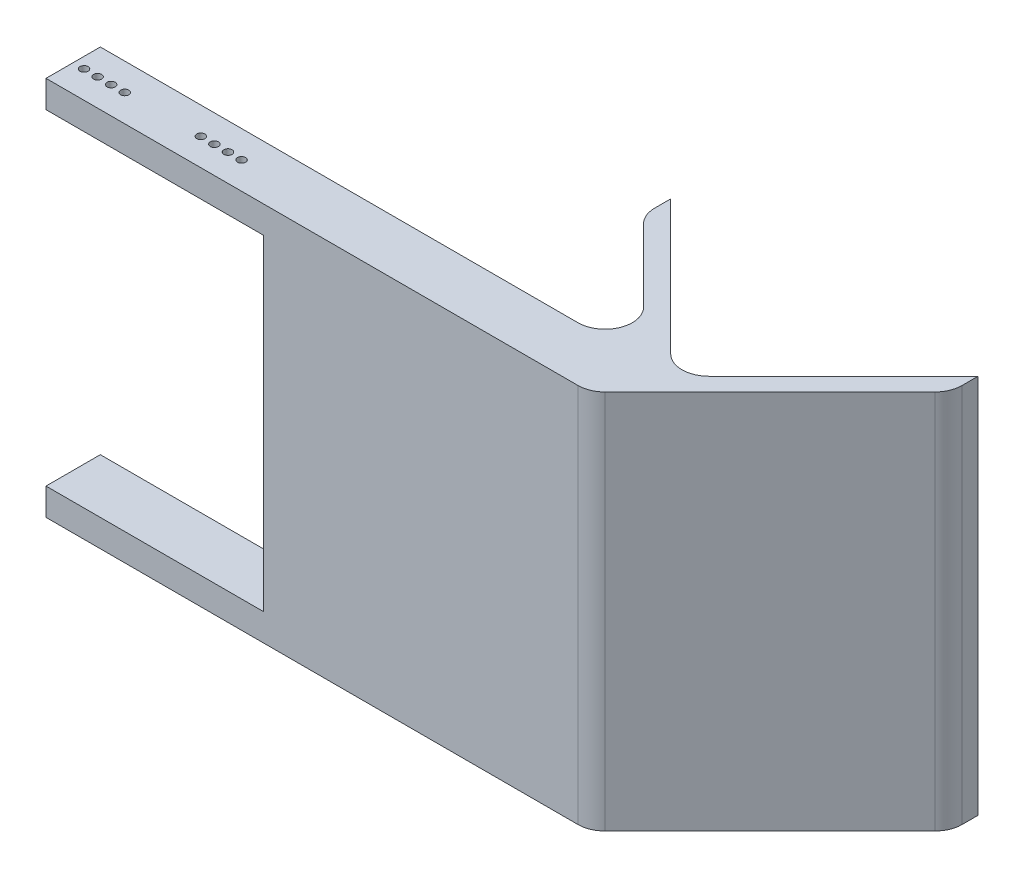
ISO-10303-21;
HEADER;
FILE_DESCRIPTION(('STEP AP214'),'2;1');
FILE_NAME('part.step','',(''),(''),'','','');
FILE_SCHEMA(('AUTOMOTIVE_DESIGN { 1 0 10303 214 1 1 1 1 }'));
ENDSEC;
DATA;
#1=APPLICATION_CONTEXT('core data for automotive mechanical design processes');
#2=APPLICATION_PROTOCOL_DEFINITION('international standard','automotive_design',2000,#1);
#3=PRODUCT_CONTEXT('',#1,'mechanical');
#4=PRODUCT('Part','Part','',(#3));
#5=PRODUCT_RELATED_PRODUCT_CATEGORY('part','',(#4));
#6=PRODUCT_DEFINITION_FORMATION('','',#4);
#7=PRODUCT_DEFINITION_CONTEXT('part definition',#1,'design');
#8=PRODUCT_DEFINITION('design','',#6,#7);
#9=PRODUCT_DEFINITION_SHAPE('','',#8);
#10=(LENGTH_UNIT() NAMED_UNIT(*) SI_UNIT(.MILLI.,.METRE.));
#11=(NAMED_UNIT(*) PLANE_ANGLE_UNIT() SI_UNIT($,.RADIAN.));
#12=(NAMED_UNIT(*) SI_UNIT($,.STERADIAN.) SOLID_ANGLE_UNIT());
#13=UNCERTAINTY_MEASURE_WITH_UNIT(LENGTH_MEASURE(1.E-05),#10,'distance_accuracy_value','');
#14=(GEOMETRIC_REPRESENTATION_CONTEXT(3) GLOBAL_UNCERTAINTY_ASSIGNED_CONTEXT((#13)) GLOBAL_UNIT_ASSIGNED_CONTEXT((#10,
#11,#12)) REPRESENTATION_CONTEXT('',''));
#15=CARTESIAN_POINT('',(0.,0.,0.));
#16=DIRECTION('',(0.,0.,1.));
#17=DIRECTION('',(1.,0.,0.));
#18=AXIS2_PLACEMENT_3D('',#15,#16,#17);
#19=CARTESIAN_POINT('',(-75.,70.,0.));
#20=DIRECTION('',(-1.,0.,0.));
#21=DIRECTION('',(0.,0.,1.));
#22=AXIS2_PLACEMENT_3D('',#19,#20,#21);
#23=PLANE('',#22);
#24=DIRECTION('',(0.,-1.,0.));
#25=VECTOR('',#24,1.);
#26=CARTESIAN_POINT('',(-75.,70.,0.));
#27=LINE('',#26,#25);
#28=CARTESIAN_POINT('',(-75.,5.,0.));
#29=VERTEX_POINT('',#28);
#30=CARTESIAN_POINT('',(-75.,0.,0.));
#31=VERTEX_POINT('',#30);
#32=EDGE_CURVE('E217',#29,#31,#27,.T.);
#33=ORIENTED_EDGE('',*,*,#32,.F.);
#34=DIRECTION('',(0.,0.,-1.));
#35=VECTOR('',#34,1.);
#36=CARTESIAN_POINT('',(-75.,5.,0.));
#37=LINE('',#36,#35);
#38=CARTESIAN_POINT('',(-75.,5.,-10.));
#39=VERTEX_POINT('',#38);
#40=EDGE_CURVE('E186',#29,#39,#37,.T.);
#41=ORIENTED_EDGE('',*,*,#40,.T.);
#42=DIRECTION('',(0.,-1.,0.));
#43=VECTOR('',#42,1.);
#44=CARTESIAN_POINT('',(-75.,70.,-10.));
#45=LINE('',#44,#43);
#46=CARTESIAN_POINT('',(-75.,0.,-10.));
#47=VERTEX_POINT('',#46);
#48=EDGE_CURVE('E250',#39,#47,#45,.T.);
#49=ORIENTED_EDGE('',*,*,#48,.T.);
#50=DIRECTION('',(0.,0.,-1.));
#51=VECTOR('',#50,1.);
#52=CARTESIAN_POINT('',(-75.,0.,0.));
#53=LINE('',#52,#51);
#54=EDGE_CURVE('E220',#31,#47,#53,.T.);
#55=ORIENTED_EDGE('',*,*,#54,.F.);
#56=EDGE_LOOP('',(#33,#41,#49,#55));
#57=FACE_BOUND('',#56,.T.);
#58=ADVANCED_FACE('F33',(#57),#23,.T.);
#59=CARTESIAN_POINT('',(24.9999999999995,70.,0.));
#60=DIRECTION('',(0.,0.,1.));
#61=DIRECTION('',(1.,0.,0.));
#62=AXIS2_PLACEMENT_3D('',#59,#60,#61);
#63=PLANE('',#62);
#64=DIRECTION('',(1.,0.,0.));
#65=VECTOR('',#64,1.);
#66=CARTESIAN_POINT('',(-75.,65.,0.));
#67=LINE('',#66,#65);
#68=CARTESIAN_POINT('',(-75.,65.,0.));
#69=VERTEX_POINT('',#68);
#70=CARTESIAN_POINT('',(-35.,65.,0.));
#71=VERTEX_POINT('',#70);
#72=EDGE_CURVE('E156',#69,#71,#67,.T.);
#73=ORIENTED_EDGE('',*,*,#72,.T.);
#74=DIRECTION('',(0.,1.,0.));
#75=VECTOR('',#74,1.);
#76=CARTESIAN_POINT('',(-35.,5.,0.));
#77=LINE('',#76,#75);
#78=CARTESIAN_POINT('',(-35.,5.,0.));
#79=VERTEX_POINT('',#78);
#80=EDGE_CURVE('E160',#79,#71,#77,.T.);
#81=ORIENTED_EDGE('',*,*,#80,.F.);
#82=DIRECTION('',(1.,0.,0.));
#83=VECTOR('',#82,1.);
#84=CARTESIAN_POINT('',(-75.,5.,0.));
#85=LINE('',#84,#83);
#86=EDGE_CURVE('E166',#29,#79,#85,.T.);
#87=ORIENTED_EDGE('',*,*,#86,.F.);
#88=ORIENTED_EDGE('',*,*,#32,.T.);
#89=DIRECTION('',(-1.,0.,0.));
#90=VECTOR('',#89,1.);
#91=CARTESIAN_POINT('',(24.9999999999995,0.,0.));
#92=LINE('',#91,#90);
#93=CARTESIAN_POINT('',(22.9289321881341,0.,0.));
#94=VERTEX_POINT('',#93);
#95=EDGE_CURVE('E191',#94,#31,#92,.T.);
#96=ORIENTED_EDGE('',*,*,#95,.F.);
#97=DIRECTION('',(0.,-1.,0.));
#98=VECTOR('',#97,1.);
#99=CARTESIAN_POINT('',(22.9289321881341,70.,0.));
#100=LINE('',#99,#98);
#101=CARTESIAN_POINT('',(22.9289321881341,70.,0.));
#102=VERTEX_POINT('',#101);
#103=EDGE_CURVE('E41',#94,#102,#100,.F.);
#104=ORIENTED_EDGE('',*,*,#103,.T.);
#105=DIRECTION('',(-1.,0.,0.));
#106=VECTOR('',#105,1.);
#107=CARTESIAN_POINT('',(24.9999999999995,70.,0.));
#108=LINE('',#107,#106);
#109=CARTESIAN_POINT('',(-75.,70.,0.));
#110=VERTEX_POINT('',#109);
#111=EDGE_CURVE('E193',#102,#110,#108,.T.);
#112=ORIENTED_EDGE('',*,*,#111,.T.);
#113=EDGE_CURVE('E162',#110,#69,#27,.T.);
#114=ORIENTED_EDGE('',*,*,#113,.T.);
#115=EDGE_LOOP('',(#73,#81,#87,#88,#96,#104,#112,#114));
#116=FACE_BOUND('',#115,.T.);
#117=ADVANCED_FACE('F158',(#116),#63,.T.);
#118=CARTESIAN_POINT('',(34.9999999999997,70.,-10.0000000000001));
#119=DIRECTION('',(0.707106781186542,0.,0.707106781186553));
#120=DIRECTION('',(0.707106781186553,0.,-0.707106781186542));
#121=AXIS2_PLACEMENT_3D('',#118,#119,#120);
#122=PLANE('',#121);
#123=DIRECTION('',(-0.707106781186553,0.,0.707106781186542));
#124=VECTOR('',#123,1.);
#125=CARTESIAN_POINT('',(58.2842712474619,70.,-33.2842712474619));
#126=LINE('',#125,#124);
#127=CARTESIAN_POINT('',(56.8198051533946,70.,-31.8198051533947));
#128=VERTEX_POINT('',#127);
#129=CARTESIAN_POINT('',(26.4644660940668,70.,-1.46446609406723));
#130=VERTEX_POINT('',#129);
#131=EDGE_CURVE('E214',#128,#130,#126,.T.);
#132=ORIENTED_EDGE('',*,*,#131,.T.);
#133=DIRECTION('',(0.,-1.,0.));
#134=VECTOR('',#133,1.);
#135=CARTESIAN_POINT('',(26.4644660940668,70.,-1.46446609406724));
#136=LINE('',#135,#134);
#137=CARTESIAN_POINT('',(26.4644660940668,0.,-1.46446609406723));
#138=VERTEX_POINT('',#137);
#139=EDGE_CURVE('E289',#130,#138,#136,.T.);
#140=ORIENTED_EDGE('',*,*,#139,.T.);
#141=DIRECTION('',(-0.707106781186553,0.,0.707106781186542));
#142=VECTOR('',#141,1.);
#143=CARTESIAN_POINT('',(34.9999999999997,0.,-10.0000000000001));
#144=LINE('',#143,#142);
#145=CARTESIAN_POINT('',(56.8198051533946,0.,-31.8198051533947));
#146=VERTEX_POINT('',#145);
#147=EDGE_CURVE('E196',#146,#138,#144,.T.);
#148=ORIENTED_EDGE('',*,*,#147,.F.);
#149=DIRECTION('',(0.,-1.,0.));
#150=VECTOR('',#149,1.);
#151=CARTESIAN_POINT('',(56.8198051533946,70.,-31.8198051533947));
#152=LINE('',#151,#150);
#153=EDGE_CURVE('E278',#146,#128,#152,.F.);
#154=ORIENTED_EDGE('',*,*,#153,.T.);
#155=EDGE_LOOP('',(#132,#140,#148,#154));
#156=FACE_BOUND('',#155,.T.);
#157=ADVANCED_FACE('F307',(#156),#122,.T.);
#158=CARTESIAN_POINT('',(58.2842712474619,70.,-38.2842712474615));
#159=DIRECTION('',(1.,0.,0.));
#160=DIRECTION('',(0.,0.,-1.));
#161=AXIS2_PLACEMENT_3D('',#158,#159,#160);
#162=PLANE('',#161);
#163=DIRECTION('',(0.,0.,1.));
#164=VECTOR('',#163,1.);
#165=CARTESIAN_POINT('',(58.2842712474619,70.,-38.2842712474615));
#166=LINE('',#165,#164);
#167=CARTESIAN_POINT('',(58.2842712474619,70.,-38.2842712474615));
#168=VERTEX_POINT('',#167);
#169=CARTESIAN_POINT('',(58.2842712474619,70.,-35.3553390593274));
#170=VERTEX_POINT('',#169);
#171=EDGE_CURVE('E211',#168,#170,#166,.T.);
#172=ORIENTED_EDGE('',*,*,#171,.T.);
#173=DIRECTION('',(0.,-1.,0.));
#174=VECTOR('',#173,1.);
#175=CARTESIAN_POINT('',(58.2842712474619,70.,-35.3553390593274));
#176=LINE('',#175,#174);
#177=CARTESIAN_POINT('',(58.2842712474619,0.,-35.3553390593274));
#178=VERTEX_POINT('',#177);
#179=EDGE_CURVE('E271',#170,#178,#176,.T.);
#180=ORIENTED_EDGE('',*,*,#179,.T.);
#181=DIRECTION('',(0.,0.,1.));
#182=VECTOR('',#181,1.);
#183=CARTESIAN_POINT('',(58.2842712474619,0.,-38.2842712474615));
#184=LINE('',#183,#182);
#185=CARTESIAN_POINT('',(58.2842712474619,0.,-38.2842712474615));
#186=VERTEX_POINT('',#185);
#187=EDGE_CURVE('E235',#186,#178,#184,.T.);
#188=ORIENTED_EDGE('',*,*,#187,.F.);
#189=DIRECTION('',(0.,-1.,0.));
#190=VECTOR('',#189,1.);
#191=CARTESIAN_POINT('',(58.2842712474619,70.,-38.2842712474615));
#192=LINE('',#191,#190);
#193=EDGE_CURVE('E240',#168,#186,#192,.T.);
#194=ORIENTED_EDGE('',*,*,#193,.F.);
#195=EDGE_LOOP('',(#172,#180,#188,#194));
#196=FACE_BOUND('',#195,.T.);
#197=ADVANCED_FACE('F316',(#196),#162,.T.);
#198=CARTESIAN_POINT('',(30.,70.,-10.));
#199=DIRECTION('',(-0.707106781186542,0.,-0.707106781186553));
#200=DIRECTION('',(-0.707106781186553,0.,0.707106781186542));
#201=AXIS2_PLACEMENT_3D('',#198,#199,#200);
#202=PLANE('',#201);
#203=DIRECTION('',(0.707106781186553,0.,-0.707106781186542));
#204=VECTOR('',#203,1.);
#205=CARTESIAN_POINT('',(30.,0.,-10.));
#206=LINE('',#205,#204);
#207=CARTESIAN_POINT('',(33.5355339059328,0.,-13.5355339059327));
#208=VERTEX_POINT('',#207);
#209=EDGE_CURVE('E233',#208,#186,#206,.T.);
#210=ORIENTED_EDGE('',*,*,#209,.F.);
#211=DIRECTION('',(0.,-1.,0.));
#212=VECTOR('',#211,1.);
#213=CARTESIAN_POINT('',(33.5355339059328,70.,-13.5355339059327));
#214=LINE('',#213,#212);
#215=CARTESIAN_POINT('',(33.5355339059328,70.,-13.5355339059327));
#216=VERTEX_POINT('',#215);
#217=EDGE_CURVE('E254',#208,#216,#214,.F.);
#218=ORIENTED_EDGE('',*,*,#217,.T.);
#219=DIRECTION('',(0.707106781186553,0.,-0.707106781186542));
#220=VECTOR('',#219,1.);
#221=CARTESIAN_POINT('',(30.,70.,-10.));
#222=LINE('',#221,#220);
#223=EDGE_CURVE('E209',#216,#168,#222,.T.);
#224=ORIENTED_EDGE('',*,*,#223,.T.);
#225=ORIENTED_EDGE('',*,*,#193,.T.);
#226=EDGE_LOOP('',(#210,#218,#224,#225));
#227=FACE_BOUND('',#226,.T.);
#228=ADVANCED_FACE('F320',(#227),#202,.T.);
#229=CARTESIAN_POINT('',(30.,70.,-10.));
#230=DIRECTION('',(-0.707106781186553,0.,0.707106781186542));
#231=DIRECTION('',(0.707106781186542,0.,0.707106781186553));
#232=AXIS2_PLACEMENT_3D('',#229,#230,#231);
#233=PLANE('',#232);
#234=DIRECTION('',(-0.707106781186543,0.,-0.707106781186553));
#235=VECTOR('',#234,1.);
#236=CARTESIAN_POINT('',(30.,70.,-10.));
#237=LINE('',#236,#235);
#238=CARTESIAN_POINT('',(26.4644660940673,70.,-13.5355339059328));
#239=VERTEX_POINT('',#238);
#240=CARTESIAN_POINT('',(1.71572875253834,70.,-38.2842712474621));
#241=VERTEX_POINT('',#240);
#242=EDGE_CURVE('E207',#239,#241,#237,.T.);
#243=ORIENTED_EDGE('',*,*,#242,.F.);
#244=DIRECTION('',(0.,-1.,0.));
#245=VECTOR('',#244,1.);
#246=CARTESIAN_POINT('',(26.4644660940673,70.,-13.5355339059328));
#247=LINE('',#246,#245);
#248=CARTESIAN_POINT('',(26.4644660940673,0.,-13.5355339059328));
#249=VERTEX_POINT('',#248);
#250=EDGE_CURVE('E243',#239,#249,#247,.T.);
#251=ORIENTED_EDGE('',*,*,#250,.T.);
#252=DIRECTION('',(-0.707106781186543,0.,-0.707106781186553));
#253=VECTOR('',#252,1.);
#254=CARTESIAN_POINT('',(30.,0.,-10.));
#255=LINE('',#254,#253);
#256=CARTESIAN_POINT('',(1.71572875253834,0.,-38.2842712474621));
#257=VERTEX_POINT('',#256);
#258=EDGE_CURVE('E231',#249,#257,#255,.T.);
#259=ORIENTED_EDGE('',*,*,#258,.T.);
#260=DIRECTION('',(0.,-1.,0.));
#261=VECTOR('',#260,1.);
#262=CARTESIAN_POINT('',(1.71572875253834,70.,-38.2842712474621));
#263=LINE('',#262,#261);
#264=EDGE_CURVE('E244',#241,#257,#263,.T.);
#265=ORIENTED_EDGE('',*,*,#264,.F.);
#266=EDGE_LOOP('',(#243,#251,#259,#265));
#267=FACE_BOUND('',#266,.T.);
#268=ADVANCED_FACE('F329',(#267),#233,.F.);
#269=CARTESIAN_POINT('',(1.71572875253834,70.,-38.2842712474621));
#270=DIRECTION('',(1.,0.,0.));
#271=DIRECTION('',(0.,0.,-1.));
#272=AXIS2_PLACEMENT_3D('',#269,#270,#271);
#273=PLANE('',#272);
#274=DIRECTION('',(0.,0.,1.));
#275=VECTOR('',#274,1.);
#276=CARTESIAN_POINT('',(1.71572875253834,0.,-38.2842712474621));
#277=LINE('',#276,#275);
#278=CARTESIAN_POINT('',(1.71572875253834,0.,-35.3553390593274));
#279=VERTEX_POINT('',#278);
#280=EDGE_CURVE('E228',#257,#279,#277,.T.);
#281=ORIENTED_EDGE('',*,*,#280,.T.);
#282=DIRECTION('',(0.,-1.,0.));
#283=VECTOR('',#282,1.);
#284=CARTESIAN_POINT('',(1.71572875253834,70.,-35.3553390593274));
#285=LINE('',#284,#283);
#286=CARTESIAN_POINT('',(1.71572875253834,70.,-35.3553390593274));
#287=VERTEX_POINT('',#286);
#288=EDGE_CURVE('E287',#279,#287,#285,.F.);
#289=ORIENTED_EDGE('',*,*,#288,.T.);
#290=DIRECTION('',(0.,0.,1.));
#291=VECTOR('',#290,1.);
#292=CARTESIAN_POINT('',(1.71572875253834,70.,-38.2842712474621));
#293=LINE('',#292,#291);
#294=EDGE_CURVE('E204',#241,#287,#293,.T.);
#295=ORIENTED_EDGE('',*,*,#294,.F.);
#296=ORIENTED_EDGE('',*,*,#264,.T.);
#297=EDGE_LOOP('',(#281,#289,#295,#296));
#298=FACE_BOUND('',#297,.T.);
#299=ADVANCED_FACE('F335',(#298),#273,.F.);
#300=CARTESIAN_POINT('',(1.71572875253834,70.,-33.2842712474619));
#301=DIRECTION('',(0.707106781186552,0.,-0.707106781186543));
#302=DIRECTION('',(-0.707106781186543,0.,-0.707106781186552));
#303=AXIS2_PLACEMENT_3D('',#300,#301,#302);
#304=PLANE('',#303);
#305=DIRECTION('',(0.707106781186542,0.,0.707106781186552));
#306=VECTOR('',#305,1.);
#307=CARTESIAN_POINT('',(1.71572875253834,70.,-33.2842712474619));
#308=LINE('',#307,#306);
#309=CARTESIAN_POINT('',(3.18019484660558,70.,-31.8198051533947));
#310=VERTEX_POINT('',#309);
#311=CARTESIAN_POINT('',(16.4644660940673,70.,-18.5355339059327));
#312=VERTEX_POINT('',#311);
#313=EDGE_CURVE('E202',#310,#312,#308,.T.);
#314=ORIENTED_EDGE('',*,*,#313,.F.);
#315=DIRECTION('',(0.,-1.,0.));
#316=VECTOR('',#315,1.);
#317=CARTESIAN_POINT('',(3.18019484660558,70.,-31.8198051533947));
#318=LINE('',#317,#316);
#319=CARTESIAN_POINT('',(3.18019484660558,0.,-31.8198051533947));
#320=VERTEX_POINT('',#319);
#321=EDGE_CURVE('E284',#310,#320,#318,.T.);
#322=ORIENTED_EDGE('',*,*,#321,.T.);
#323=DIRECTION('',(0.707106781186542,0.,0.707106781186552));
#324=VECTOR('',#323,1.);
#325=CARTESIAN_POINT('',(1.71572875253834,0.,-33.2842712474619));
#326=LINE('',#325,#324);
#327=CARTESIAN_POINT('',(16.4644660940673,0.,-18.5355339059327));
#328=VERTEX_POINT('',#327);
#329=EDGE_CURVE('E226',#320,#328,#326,.T.);
#330=ORIENTED_EDGE('',*,*,#329,.T.);
#331=DIRECTION('',(0.,-1.,0.));
#332=VECTOR('',#331,1.);
#333=CARTESIAN_POINT('',(16.4644660940673,70.,-18.5355339059327));
#334=LINE('',#333,#332);
#335=EDGE_CURVE('E263',#328,#312,#334,.F.);
#336=ORIENTED_EDGE('',*,*,#335,.T.);
#337=EDGE_LOOP('',(#314,#322,#330,#336));
#338=FACE_BOUND('',#337,.T.);
#339=ADVANCED_FACE('F343',(#338),#304,.F.);
#340=CARTESIAN_POINT('',(-75.,70.,-10.));
#341=DIRECTION('',(0.,0.,-1.));
#342=DIRECTION('',(-1.,0.,0.));
#343=AXIS2_PLACEMENT_3D('',#340,#341,#342);
#344=PLANE('',#343);
#345=DIRECTION('',(0.,1.,0.));
#346=VECTOR('',#345,1.);
#347=CARTESIAN_POINT('',(-35.,5.,-10.));
#348=LINE('',#347,#346);
#349=CARTESIAN_POINT('',(-35.,5.,-10.));
#350=VERTEX_POINT('',#349);
#351=CARTESIAN_POINT('',(-35.,65.,-10.));
#352=VERTEX_POINT('',#351);
#353=EDGE_CURVE('E176',#350,#352,#348,.T.);
#354=ORIENTED_EDGE('',*,*,#353,.T.);
#355=DIRECTION('',(1.,0.,0.));
#356=VECTOR('',#355,1.);
#357=CARTESIAN_POINT('',(-75.,65.,-10.));
#358=LINE('',#357,#356);
#359=CARTESIAN_POINT('',(-75.,65.,-10.));
#360=VERTEX_POINT('',#359);
#361=EDGE_CURVE('E180',#360,#352,#358,.T.);
#362=ORIENTED_EDGE('',*,*,#361,.F.);
#363=CARTESIAN_POINT('',(-75.,70.,-10.));
#364=VERTEX_POINT('',#363);
#365=EDGE_CURVE('E247',#364,#360,#45,.T.);
#366=ORIENTED_EDGE('',*,*,#365,.F.);
#367=DIRECTION('',(1.,0.,0.));
#368=VECTOR('',#367,1.);
#369=CARTESIAN_POINT('',(-75.,70.,-10.));
#370=LINE('',#369,#368);
#371=CARTESIAN_POINT('',(12.9289321881346,70.,-10.));
#372=VERTEX_POINT('',#371);
#373=EDGE_CURVE('E199',#364,#372,#370,.T.);
#374=ORIENTED_EDGE('',*,*,#373,.T.);
#375=DIRECTION('',(0.,-1.,0.));
#376=VECTOR('',#375,1.);
#377=CARTESIAN_POINT('',(12.9289321881346,70.,-10.));
#378=LINE('',#377,#376);
#379=CARTESIAN_POINT('',(12.9289321881346,0.,-10.));
#380=VERTEX_POINT('',#379);
#381=EDGE_CURVE('E260',#372,#380,#378,.T.);
#382=ORIENTED_EDGE('',*,*,#381,.T.);
#383=DIRECTION('',(1.,0.,0.));
#384=VECTOR('',#383,1.);
#385=CARTESIAN_POINT('',(-75.,0.,-10.));
#386=LINE('',#385,#384);
#387=EDGE_CURVE('E223',#47,#380,#386,.T.);
#388=ORIENTED_EDGE('',*,*,#387,.F.);
#389=ORIENTED_EDGE('',*,*,#48,.F.);
#390=DIRECTION('',(1.,0.,0.));
#391=VECTOR('',#390,1.);
#392=CARTESIAN_POINT('',(-75.,5.,-10.));
#393=LINE('',#392,#391);
#394=EDGE_CURVE('E48',#39,#350,#393,.T.);
#395=ORIENTED_EDGE('',*,*,#394,.T.);
#396=EDGE_LOOP('',(#354,#362,#366,#374,#382,#388,#389,#395));
#397=FACE_BOUND('',#396,.T.);
#398=ADVANCED_FACE('F351',(#397),#344,.T.);
#399=DIRECTION('',(0.,0.,-1.));
#400=VECTOR('',#399,1.);
#401=CARTESIAN_POINT('',(-75.,65.,0.));
#402=LINE('',#401,#400);
#403=EDGE_CURVE('E189',#69,#360,#402,.T.);
#404=ORIENTED_EDGE('',*,*,#403,.F.);
#405=ORIENTED_EDGE('',*,*,#113,.F.);
#406=DIRECTION('',(0.,0.,-1.));
#407=VECTOR('',#406,1.);
#408=CARTESIAN_POINT('',(-75.,70.,0.));
#409=LINE('',#408,#407);
#410=EDGE_CURVE('E195',#110,#364,#409,.T.);
#411=ORIENTED_EDGE('',*,*,#410,.T.);
#412=ORIENTED_EDGE('',*,*,#365,.T.);
#413=EDGE_LOOP('',(#404,#405,#411,#412));
#414=FACE_BOUND('',#413,.T.);
#415=ADVANCED_FACE('F354',(#414),#23,.T.);
#416=CARTESIAN_POINT('',(0.,70.,0.));
#417=DIRECTION('',(0.,-1.,0.));
#418=DIRECTION('',(0.,0.,-1.));
#419=AXIS2_PLACEMENT_3D('',#416,#417,#418);
#420=PLANE('',#419);
#421=CARTESIAN_POINT('',(-73.,70.,-5.));
#422=DIRECTION('',(0.,-1.,0.));
#423=DIRECTION('',(0.,0.,-1.));
#424=AXIS2_PLACEMENT_3D('',#421,#422,#423);
#425=CIRCLE('',#424,0.749999999999999);
#426=CARTESIAN_POINT('',(-73.,70.,-5.75));
#427=VERTEX_POINT('',#426);
#428=EDGE_CURVE('E379',#427,#427,#425,.T.);
#429=ORIENTED_EDGE('',*,*,#428,.T.);
#430=EDGE_LOOP('',(#429));
#431=FACE_BOUND('',#430,.T.);
#432=CARTESIAN_POINT('',(-51.5,70.,-5.));
#433=DIRECTION('',(0.,-1.,0.));
#434=DIRECTION('',(0.,0.,-1.));
#435=AXIS2_PLACEMENT_3D('',#432,#433,#434);
#436=CIRCLE('',#435,0.749999999999999);
#437=CARTESIAN_POINT('',(-51.5,70.,-5.75));
#438=VERTEX_POINT('',#437);
#439=EDGE_CURVE('E382',#438,#438,#436,.T.);
#440=ORIENTED_EDGE('',*,*,#439,.T.);
#441=EDGE_LOOP('',(#440));
#442=FACE_BOUND('',#441,.T.);
#443=CARTESIAN_POINT('',(-49.,70.,-5.));
#444=DIRECTION('',(0.,-1.,0.));
#445=DIRECTION('',(0.,0.,-1.));
#446=AXIS2_PLACEMENT_3D('',#443,#444,#445);
#447=CIRCLE('',#446,0.749999999999999);
#448=CARTESIAN_POINT('',(-49.,70.,-5.75));
#449=VERTEX_POINT('',#448);
#450=EDGE_CURVE('E385',#449,#449,#447,.T.);
#451=ORIENTED_EDGE('',*,*,#450,.T.);
#452=EDGE_LOOP('',(#451));
#453=FACE_BOUND('',#452,.T.);
#454=CARTESIAN_POINT('',(-46.5,70.,-5.));
#455=DIRECTION('',(0.,-1.,0.));
#456=DIRECTION('',(0.,0.,-1.));
#457=AXIS2_PLACEMENT_3D('',#454,#455,#456);
#458=CIRCLE('',#457,0.749999999999999);
#459=CARTESIAN_POINT('',(-46.5,70.,-5.75));
#460=VERTEX_POINT('',#459);
#461=EDGE_CURVE('E388',#460,#460,#458,.T.);
#462=ORIENTED_EDGE('',*,*,#461,.T.);
#463=EDGE_LOOP('',(#462));
#464=FACE_BOUND('',#463,.T.);
#465=CARTESIAN_POINT('',(-65.5,70.,-5.));
#466=DIRECTION('',(0.,-1.,0.));
#467=DIRECTION('',(0.,0.,-1.));
#468=AXIS2_PLACEMENT_3D('',#465,#466,#467);
#469=CIRCLE('',#468,0.749999999999999);
#470=CARTESIAN_POINT('',(-65.5,70.,-5.75));
#471=VERTEX_POINT('',#470);
#472=EDGE_CURVE('E391',#471,#471,#469,.T.);
#473=ORIENTED_EDGE('',*,*,#472,.T.);
#474=EDGE_LOOP('',(#473));
#475=FACE_BOUND('',#474,.T.);
#476=CARTESIAN_POINT('',(-70.5,70.,-5.));
#477=DIRECTION('',(0.,-1.,0.));
#478=DIRECTION('',(0.,0.,-1.));
#479=AXIS2_PLACEMENT_3D('',#476,#477,#478);
#480=CIRCLE('',#479,0.749999999999999);
#481=CARTESIAN_POINT('',(-70.5,70.,-5.75));
#482=VERTEX_POINT('',#481);
#483=EDGE_CURVE('E394',#482,#482,#480,.T.);
#484=ORIENTED_EDGE('',*,*,#483,.T.);
#485=EDGE_LOOP('',(#484));
#486=FACE_BOUND('',#485,.T.);
#487=CARTESIAN_POINT('',(-68.,70.,-5.));
#488=DIRECTION('',(0.,-1.,0.));
#489=DIRECTION('',(0.,0.,-1.));
#490=AXIS2_PLACEMENT_3D('',#487,#488,#489);
#491=CIRCLE('',#490,0.749999999999999);
#492=CARTESIAN_POINT('',(-68.,70.,-5.75));
#493=VERTEX_POINT('',#492);
#494=EDGE_CURVE('E397',#493,#493,#491,.T.);
#495=ORIENTED_EDGE('',*,*,#494,.T.);
#496=EDGE_LOOP('',(#495));
#497=FACE_BOUND('',#496,.T.);
#498=CARTESIAN_POINT('',(-44.,70.,-5.));
#499=DIRECTION('',(0.,-1.,0.));
#500=DIRECTION('',(0.,0.,-1.));
#501=AXIS2_PLACEMENT_3D('',#498,#499,#500);
#502=CIRCLE('',#501,0.749999999999999);
#503=CARTESIAN_POINT('',(-44.,70.,-5.75));
#504=VERTEX_POINT('',#503);
#505=EDGE_CURVE('E372',#504,#504,#502,.T.);
#506=ORIENTED_EDGE('',*,*,#505,.T.);
#507=EDGE_LOOP('',(#506));
#508=FACE_BOUND('',#507,.T.);
#509=ORIENTED_EDGE('',*,*,#111,.F.);
#510=CARTESIAN_POINT('',(22.9289321881341,70.,-5.));
#511=DIRECTION('',(0.,-1.,0.));
#512=DIRECTION('',(0.,0.,-1.));
#513=AXIS2_PLACEMENT_3D('',#510,#511,#512);
#514=CIRCLE('',#513,5.);
#515=EDGE_CURVE('E11',#102,#130,#514,.F.);
#516=ORIENTED_EDGE('',*,*,#515,.T.);
#517=ORIENTED_EDGE('',*,*,#131,.F.);
#518=CARTESIAN_POINT('',(53.2842712474619,70.,-35.3553390593274));
#519=DIRECTION('',(0.,-1.,0.));
#520=DIRECTION('',(0.,0.,-1.));
#521=AXIS2_PLACEMENT_3D('',#518,#519,#520);
#522=CIRCLE('',#521,5.);
#523=EDGE_CURVE('E282',#128,#170,#522,.F.);
#524=ORIENTED_EDGE('',*,*,#523,.T.);
#525=ORIENTED_EDGE('',*,*,#171,.F.);
#526=ORIENTED_EDGE('',*,*,#223,.F.);
#527=CARTESIAN_POINT('',(30.,70.,-17.0710678118655));
#528=DIRECTION('',(0.,-1.,0.));
#529=DIRECTION('',(0.,0.,-1.));
#530=AXIS2_PLACEMENT_3D('',#527,#528,#529);
#531=CIRCLE('',#530,5.);
#532=EDGE_CURVE('E258',#216,#239,#531,.T.);
#533=ORIENTED_EDGE('',*,*,#532,.T.);
#534=ORIENTED_EDGE('',*,*,#242,.T.);
#535=ORIENTED_EDGE('',*,*,#294,.T.);
#536=CARTESIAN_POINT('',(6.71572875253834,70.,-35.3553390593274));
#537=DIRECTION('',(0.,-1.,0.));
#538=DIRECTION('',(0.,0.,-1.));
#539=AXIS2_PLACEMENT_3D('',#536,#537,#538);
#540=CIRCLE('',#539,5.);
#541=EDGE_CURVE('E280',#287,#310,#540,.F.);
#542=ORIENTED_EDGE('',*,*,#541,.T.);
#543=ORIENTED_EDGE('',*,*,#313,.T.);
#544=CARTESIAN_POINT('',(12.9289321881346,70.,-15.));
#545=DIRECTION('',(0.,-1.,0.));
#546=DIRECTION('',(0.,0.,-1.));
#547=AXIS2_PLACEMENT_3D('',#544,#545,#546);
#548=CIRCLE('',#547,5.);
#549=EDGE_CURVE('E269',#312,#372,#548,.T.);
#550=ORIENTED_EDGE('',*,*,#549,.T.);
#551=ORIENTED_EDGE('',*,*,#373,.F.);
#552=ORIENTED_EDGE('',*,*,#410,.F.);
#553=EDGE_LOOP('',(#509,#516,#517,#524,#525,#526,#533,#534,#535,#542,#543,#550,#551,#552));
#554=FACE_BOUND('',#553,.T.);
#555=ADVANCED_FACE('F303',(#431,#442,#453,#464,#475,#486,#497,#508,#554),#420,.F.);
#556=CARTESIAN_POINT('',(0.,0.,0.));
#557=DIRECTION('',(0.,-1.,0.));
#558=DIRECTION('',(0.,0.,-1.));
#559=AXIS2_PLACEMENT_3D('',#556,#557,#558);
#560=PLANE('',#559);
#561=ORIENTED_EDGE('',*,*,#147,.T.);
#562=CARTESIAN_POINT('',(22.9289321881341,0.,-5.));
#563=DIRECTION('',(0.,-1.,0.));
#564=DIRECTION('',(0.,0.,-1.));
#565=AXIS2_PLACEMENT_3D('',#562,#563,#564);
#566=CIRCLE('',#565,5.);
#567=EDGE_CURVE('E292',#138,#94,#566,.T.);
#568=ORIENTED_EDGE('',*,*,#567,.T.);
#569=ORIENTED_EDGE('',*,*,#95,.T.);
#570=ORIENTED_EDGE('',*,*,#54,.T.);
#571=ORIENTED_EDGE('',*,*,#387,.T.);
#572=CARTESIAN_POINT('',(12.9289321881346,0.,-15.));
#573=DIRECTION('',(0.,-1.,0.));
#574=DIRECTION('',(0.,0.,-1.));
#575=AXIS2_PLACEMENT_3D('',#572,#573,#574);
#576=CIRCLE('',#575,5.);
#577=EDGE_CURVE('E266',#380,#328,#576,.F.);
#578=ORIENTED_EDGE('',*,*,#577,.T.);
#579=ORIENTED_EDGE('',*,*,#329,.F.);
#580=CARTESIAN_POINT('',(6.71572875253834,0.,-35.3553390593274));
#581=DIRECTION('',(0.,-1.,0.));
#582=DIRECTION('',(0.,0.,-1.));
#583=AXIS2_PLACEMENT_3D('',#580,#581,#582);
#584=CIRCLE('',#583,5.);
#585=EDGE_CURVE('E274',#320,#279,#584,.T.);
#586=ORIENTED_EDGE('',*,*,#585,.T.);
#587=ORIENTED_EDGE('',*,*,#280,.F.);
#588=ORIENTED_EDGE('',*,*,#258,.F.);
#589=CARTESIAN_POINT('',(30.,0.,-17.0710678118655));
#590=DIRECTION('',(0.,-1.,0.));
#591=DIRECTION('',(0.,0.,-1.));
#592=AXIS2_PLACEMENT_3D('',#589,#590,#591);
#593=CIRCLE('',#592,5.);
#594=EDGE_CURVE('E256',#249,#208,#593,.F.);
#595=ORIENTED_EDGE('',*,*,#594,.T.);
#596=ORIENTED_EDGE('',*,*,#209,.T.);
#597=ORIENTED_EDGE('',*,*,#187,.T.);
#598=CARTESIAN_POINT('',(53.2842712474619,0.,-35.3553390593274));
#599=DIRECTION('',(0.,-1.,0.));
#600=DIRECTION('',(0.,0.,-1.));
#601=AXIS2_PLACEMENT_3D('',#598,#599,#600);
#602=CIRCLE('',#601,5.);
#603=EDGE_CURVE('E276',#178,#146,#602,.T.);
#604=ORIENTED_EDGE('',*,*,#603,.T.);
#605=EDGE_LOOP('',(#561,#568,#569,#570,#571,#578,#579,#586,#587,#588,#595,#596,#597,#604));
#606=FACE_BOUND('',#605,.T.);
#607=ADVANCED_FACE('F294',(#606),#560,.T.);
#608=CARTESIAN_POINT('',(30.,70.,-17.0710678118655));
#609=DIRECTION('',(0.,-1.,0.));
#610=DIRECTION('',(0.,0.,-1.));
#611=AXIS2_PLACEMENT_3D('',#608,#609,#610);
#612=CYLINDRICAL_SURFACE('',#611,5.);
#613=ORIENTED_EDGE('',*,*,#532,.F.);
#614=ORIENTED_EDGE('',*,*,#217,.F.);
#615=ORIENTED_EDGE('',*,*,#594,.F.);
#616=ORIENTED_EDGE('',*,*,#250,.F.);
#617=EDGE_LOOP('',(#613,#614,#615,#616));
#618=FACE_BOUND('',#617,.T.);
#619=ADVANCED_FACE('F326',(#618),#612,.F.);
#620=CARTESIAN_POINT('',(12.9289321881346,70.,-15.));
#621=DIRECTION('',(0.,-1.,0.));
#622=DIRECTION('',(0.,0.,-1.));
#623=AXIS2_PLACEMENT_3D('',#620,#621,#622);
#624=CYLINDRICAL_SURFACE('',#623,5.);
#625=ORIENTED_EDGE('',*,*,#549,.F.);
#626=ORIENTED_EDGE('',*,*,#335,.F.);
#627=ORIENTED_EDGE('',*,*,#577,.F.);
#628=ORIENTED_EDGE('',*,*,#381,.F.);
#629=EDGE_LOOP('',(#625,#626,#627,#628));
#630=FACE_BOUND('',#629,.T.);
#631=ADVANCED_FACE('F348',(#630),#624,.F.);
#632=CARTESIAN_POINT('',(53.2842712474619,70.,-35.3553390593274));
#633=DIRECTION('',(0.,-1.,0.));
#634=DIRECTION('',(0.,0.,-1.));
#635=AXIS2_PLACEMENT_3D('',#632,#633,#634);
#636=CYLINDRICAL_SURFACE('',#635,5.);
#637=ORIENTED_EDGE('',*,*,#523,.F.);
#638=ORIENTED_EDGE('',*,*,#153,.F.);
#639=ORIENTED_EDGE('',*,*,#603,.F.);
#640=ORIENTED_EDGE('',*,*,#179,.F.);
#641=EDGE_LOOP('',(#637,#638,#639,#640));
#642=FACE_BOUND('',#641,.T.);
#643=ADVANCED_FACE('F310',(#642),#636,.T.);
#644=CARTESIAN_POINT('',(6.71572875253834,70.,-35.3553390593274));
#645=DIRECTION('',(0.,-1.,0.));
#646=DIRECTION('',(0.,0.,-1.));
#647=AXIS2_PLACEMENT_3D('',#644,#645,#646);
#648=CYLINDRICAL_SURFACE('',#647,5.);
#649=ORIENTED_EDGE('',*,*,#541,.F.);
#650=ORIENTED_EDGE('',*,*,#288,.F.);
#651=ORIENTED_EDGE('',*,*,#585,.F.);
#652=ORIENTED_EDGE('',*,*,#321,.F.);
#653=EDGE_LOOP('',(#649,#650,#651,#652));
#654=FACE_BOUND('',#653,.T.);
#655=ADVANCED_FACE('F339',(#654),#648,.T.);
#656=CARTESIAN_POINT('',(22.9289321881341,70.,-5.));
#657=DIRECTION('',(0.,-1.,0.));
#658=DIRECTION('',(0.,0.,-1.));
#659=AXIS2_PLACEMENT_3D('',#656,#657,#658);
#660=CYLINDRICAL_SURFACE('',#659,5.);
#661=ORIENTED_EDGE('',*,*,#515,.F.);
#662=ORIENTED_EDGE('',*,*,#103,.F.);
#663=ORIENTED_EDGE('',*,*,#567,.F.);
#664=ORIENTED_EDGE('',*,*,#139,.F.);
#665=EDGE_LOOP('',(#661,#662,#663,#664));
#666=FACE_BOUND('',#665,.T.);
#667=ADVANCED_FACE('F35',(#666),#660,.T.);
#668=CARTESIAN_POINT('',(-75.,65.,0.));
#669=DIRECTION('',(0.,1.,0.));
#670=DIRECTION('',(0.,0.,1.));
#671=AXIS2_PLACEMENT_3D('',#668,#669,#670);
#672=PLANE('',#671);
#673=CARTESIAN_POINT('',(-73.,65.,-5.));
#674=DIRECTION('',(0.,-1.,0.));
#675=DIRECTION('',(1.,0.,0.));
#676=AXIS2_PLACEMENT_3D('',#673,#674,#675);
#677=CIRCLE('',#676,0.749999999999999);
#678=CARTESIAN_POINT('',(-72.25,65.,-5.));
#679=VERTEX_POINT('',#678);
#680=EDGE_CURVE('E400',#679,#679,#677,.T.);
#681=ORIENTED_EDGE('',*,*,#680,.F.);
#682=EDGE_LOOP('',(#681));
#683=FACE_BOUND('',#682,.T.);
#684=CARTESIAN_POINT('',(-51.5,65.,-5.));
#685=DIRECTION('',(0.,-1.,0.));
#686=DIRECTION('',(1.,0.,0.));
#687=AXIS2_PLACEMENT_3D('',#684,#685,#686);
#688=CIRCLE('',#687,0.749999999999999);
#689=CARTESIAN_POINT('',(-50.75,65.,-5.));
#690=VERTEX_POINT('',#689);
#691=EDGE_CURVE('E414',#690,#690,#688,.T.);
#692=ORIENTED_EDGE('',*,*,#691,.F.);
#693=EDGE_LOOP('',(#692));
#694=FACE_BOUND('',#693,.T.);
#695=CARTESIAN_POINT('',(-49.,65.,-5.));
#696=DIRECTION('',(0.,-1.,0.));
#697=DIRECTION('',(1.,0.,0.));
#698=AXIS2_PLACEMENT_3D('',#695,#696,#697);
#699=CIRCLE('',#698,0.749999999999999);
#700=CARTESIAN_POINT('',(-48.25,65.,-5.));
#701=VERTEX_POINT('',#700);
#702=EDGE_CURVE('E405',#701,#701,#699,.T.);
#703=ORIENTED_EDGE('',*,*,#702,.F.);
#704=EDGE_LOOP('',(#703));
#705=FACE_BOUND('',#704,.T.);
#706=CARTESIAN_POINT('',(-46.5,65.,-5.));
#707=DIRECTION('',(0.,-1.,0.));
#708=DIRECTION('',(1.,0.,0.));
#709=AXIS2_PLACEMENT_3D('',#706,#707,#708);
#710=CIRCLE('',#709,0.749999999999999);
#711=CARTESIAN_POINT('',(-45.75,65.,-5.));
#712=VERTEX_POINT('',#711);
#713=EDGE_CURVE('E401',#712,#712,#710,.T.);
#714=ORIENTED_EDGE('',*,*,#713,.F.);
#715=EDGE_LOOP('',(#714));
#716=FACE_BOUND('',#715,.T.);
#717=CARTESIAN_POINT('',(-65.5,65.,-5.));
#718=DIRECTION('',(0.,-1.,0.));
#719=DIRECTION('',(1.,0.,0.));
#720=AXIS2_PLACEMENT_3D('',#717,#718,#719);
#721=CIRCLE('',#720,0.749999999999999);
#722=CARTESIAN_POINT('',(-64.75,65.,-5.));
#723=VERTEX_POINT('',#722);
#724=EDGE_CURVE('E404',#723,#723,#721,.T.);
#725=ORIENTED_EDGE('',*,*,#724,.F.);
#726=EDGE_LOOP('',(#725));
#727=FACE_BOUND('',#726,.T.);
#728=CARTESIAN_POINT('',(-70.5,65.,-5.));
#729=DIRECTION('',(0.,-1.,0.));
#730=DIRECTION('',(1.,0.,0.));
#731=AXIS2_PLACEMENT_3D('',#728,#729,#730);
#732=CIRCLE('',#731,0.749999999999999);
#733=CARTESIAN_POINT('',(-69.75,65.,-5.));
#734=VERTEX_POINT('',#733);
#735=EDGE_CURVE('E408',#734,#734,#732,.T.);
#736=ORIENTED_EDGE('',*,*,#735,.F.);
#737=EDGE_LOOP('',(#736));
#738=FACE_BOUND('',#737,.T.);
#739=CARTESIAN_POINT('',(-68.,65.,-5.));
#740=DIRECTION('',(0.,-1.,0.));
#741=DIRECTION('',(1.,0.,0.));
#742=AXIS2_PLACEMENT_3D('',#739,#740,#741);
#743=CIRCLE('',#742,0.749999999999999);
#744=CARTESIAN_POINT('',(-67.25,65.,-5.));
#745=VERTEX_POINT('',#744);
#746=EDGE_CURVE('E411',#745,#745,#743,.T.);
#747=ORIENTED_EDGE('',*,*,#746,.F.);
#748=EDGE_LOOP('',(#747));
#749=FACE_BOUND('',#748,.T.);
#750=CARTESIAN_POINT('',(-44.,65.,-5.));
#751=DIRECTION('',(0.,-1.,0.));
#752=DIRECTION('',(0.,0.,-1.));
#753=AXIS2_PLACEMENT_3D('',#750,#751,#752);
#754=CIRCLE('',#753,0.749999999999999);
#755=CARTESIAN_POINT('',(-44.,65.,-5.75));
#756=VERTEX_POINT('',#755);
#757=EDGE_CURVE('E374',#756,#756,#754,.T.);
#758=ORIENTED_EDGE('',*,*,#757,.F.);
#759=EDGE_LOOP('',(#758));
#760=FACE_BOUND('',#759,.T.);
#761=ORIENTED_EDGE('',*,*,#361,.T.);
#762=DIRECTION('',(0.,0.,-1.));
#763=VECTOR('',#762,1.);
#764=CARTESIAN_POINT('',(-35.,65.,0.));
#765=LINE('',#764,#763);
#766=EDGE_CURVE('E173',#71,#352,#765,.T.);
#767=ORIENTED_EDGE('',*,*,#766,.F.);
#768=ORIENTED_EDGE('',*,*,#72,.F.);
#769=ORIENTED_EDGE('',*,*,#403,.T.);
#770=EDGE_LOOP('',(#761,#767,#768,#769));
#771=FACE_BOUND('',#770,.T.);
#772=ADVANCED_FACE('F178',(#683,#694,#705,#716,#727,#738,#749,#760,#771),#672,.F.);
#773=CARTESIAN_POINT('',(-75.,5.,0.));
#774=DIRECTION('',(0.,1.,0.));
#775=DIRECTION('',(-1.,0.,0.));
#776=AXIS2_PLACEMENT_3D('',#773,#774,#775);
#777=PLANE('',#776);
#778=ORIENTED_EDGE('',*,*,#394,.F.);
#779=ORIENTED_EDGE('',*,*,#40,.F.);
#780=ORIENTED_EDGE('',*,*,#86,.T.);
#781=DIRECTION('',(0.,0.,-1.));
#782=VECTOR('',#781,1.);
#783=CARTESIAN_POINT('',(-35.,5.,0.));
#784=LINE('',#783,#782);
#785=EDGE_CURVE('E175',#79,#350,#784,.T.);
#786=ORIENTED_EDGE('',*,*,#785,.T.);
#787=EDGE_LOOP('',(#778,#779,#780,#786));
#788=FACE_BOUND('',#787,.T.);
#789=ADVANCED_FACE('F371',(#788),#777,.T.);
#790=CARTESIAN_POINT('',(-35.,5.,0.));
#791=DIRECTION('',(-1.,0.,0.));
#792=DIRECTION('',(0.,0.,1.));
#793=AXIS2_PLACEMENT_3D('',#790,#791,#792);
#794=PLANE('',#793);
#795=ORIENTED_EDGE('',*,*,#353,.F.);
#796=ORIENTED_EDGE('',*,*,#785,.F.);
#797=ORIENTED_EDGE('',*,*,#80,.T.);
#798=ORIENTED_EDGE('',*,*,#766,.T.);
#799=EDGE_LOOP('',(#795,#796,#797,#798));
#800=FACE_BOUND('',#799,.T.);
#801=ADVANCED_FACE('F172',(#800),#794,.T.);
#802=CARTESIAN_POINT('',(-44.,75.,-5.));
#803=DIRECTION('',(0.,-1.,0.));
#804=DIRECTION('',(0.,0.,-1.));
#805=AXIS2_PLACEMENT_3D('',#802,#803,#804);
#806=CYLINDRICAL_SURFACE('',#805,0.749999999999999);
#807=ORIENTED_EDGE('',*,*,#757,.T.);
#808=EDGE_LOOP('',(#807));
#809=FACE_BOUND('',#808,.T.);
#810=ORIENTED_EDGE('',*,*,#505,.F.);
#811=EDGE_LOOP('',(#810));
#812=FACE_BOUND('',#811,.T.);
#813=ADVANCED_FACE('F442',(#809,#812),#806,.F.);
#814=CARTESIAN_POINT('',(-68.,75.,-5.));
#815=DIRECTION('',(0.,-1.,0.));
#816=DIRECTION('',(1.,0.,0.));
#817=AXIS2_PLACEMENT_3D('',#814,#815,#816);
#818=CYLINDRICAL_SURFACE('',#817,0.749999999999999);
#819=ORIENTED_EDGE('',*,*,#746,.T.);
#820=EDGE_LOOP('',(#819));
#821=FACE_BOUND('',#820,.T.);
#822=ORIENTED_EDGE('',*,*,#494,.F.);
#823=EDGE_LOOP('',(#822));
#824=FACE_BOUND('',#823,.T.);
#825=ADVANCED_FACE('F445',(#821,#824),#818,.F.);
#826=CARTESIAN_POINT('',(-70.5,75.,-5.));
#827=DIRECTION('',(0.,-1.,0.));
#828=DIRECTION('',(1.,0.,0.));
#829=AXIS2_PLACEMENT_3D('',#826,#827,#828);
#830=CYLINDRICAL_SURFACE('',#829,0.749999999999999);
#831=ORIENTED_EDGE('',*,*,#735,.T.);
#832=EDGE_LOOP('',(#831));
#833=FACE_BOUND('',#832,.T.);
#834=ORIENTED_EDGE('',*,*,#483,.F.);
#835=EDGE_LOOP('',(#834));
#836=FACE_BOUND('',#835,.T.);
#837=ADVANCED_FACE('F453',(#833,#836),#830,.F.);
#838=CARTESIAN_POINT('',(-65.5,75.,-5.));
#839=DIRECTION('',(0.,-1.,0.));
#840=DIRECTION('',(1.,0.,0.));
#841=AXIS2_PLACEMENT_3D('',#838,#839,#840);
#842=CYLINDRICAL_SURFACE('',#841,0.749999999999999);
#843=ORIENTED_EDGE('',*,*,#724,.T.);
#844=EDGE_LOOP('',(#843));
#845=FACE_BOUND('',#844,.T.);
#846=ORIENTED_EDGE('',*,*,#472,.F.);
#847=EDGE_LOOP('',(#846));
#848=FACE_BOUND('',#847,.T.);
#849=ADVANCED_FACE('F536',(#845,#848),#842,.F.);
#850=CARTESIAN_POINT('',(-46.5,75.,-5.));
#851=DIRECTION('',(0.,-1.,0.));
#852=DIRECTION('',(1.,0.,0.));
#853=AXIS2_PLACEMENT_3D('',#850,#851,#852);
#854=CYLINDRICAL_SURFACE('',#853,0.749999999999999);
#855=ORIENTED_EDGE('',*,*,#713,.T.);
#856=EDGE_LOOP('',(#855));
#857=FACE_BOUND('',#856,.T.);
#858=ORIENTED_EDGE('',*,*,#461,.F.);
#859=EDGE_LOOP('',(#858));
#860=FACE_BOUND('',#859,.T.);
#861=ADVANCED_FACE('F458',(#857,#860),#854,.F.);
#862=CARTESIAN_POINT('',(-49.,75.,-5.));
#863=DIRECTION('',(0.,-1.,0.));
#864=DIRECTION('',(1.,0.,0.));
#865=AXIS2_PLACEMENT_3D('',#862,#863,#864);
#866=CYLINDRICAL_SURFACE('',#865,0.749999999999999);
#867=ORIENTED_EDGE('',*,*,#702,.T.);
#868=EDGE_LOOP('',(#867));
#869=FACE_BOUND('',#868,.T.);
#870=ORIENTED_EDGE('',*,*,#450,.F.);
#871=EDGE_LOOP('',(#870));
#872=FACE_BOUND('',#871,.T.);
#873=ADVANCED_FACE('F554',(#869,#872),#866,.F.);
#874=CARTESIAN_POINT('',(-51.5,75.,-5.));
#875=DIRECTION('',(0.,-1.,0.));
#876=DIRECTION('',(1.,0.,0.));
#877=AXIS2_PLACEMENT_3D('',#874,#875,#876);
#878=CYLINDRICAL_SURFACE('',#877,0.749999999999999);
#879=ORIENTED_EDGE('',*,*,#691,.T.);
#880=EDGE_LOOP('',(#879));
#881=FACE_BOUND('',#880,.T.);
#882=ORIENTED_EDGE('',*,*,#439,.F.);
#883=EDGE_LOOP('',(#882));
#884=FACE_BOUND('',#883,.T.);
#885=ADVANCED_FACE('F563',(#881,#884),#878,.F.);
#886=CARTESIAN_POINT('',(-73.,75.,-5.));
#887=DIRECTION('',(0.,-1.,0.));
#888=DIRECTION('',(1.,0.,0.));
#889=AXIS2_PLACEMENT_3D('',#886,#887,#888);
#890=CYLINDRICAL_SURFACE('',#889,0.749999999999999);
#891=ORIENTED_EDGE('',*,*,#680,.T.);
#892=EDGE_LOOP('',(#891));
#893=FACE_BOUND('',#892,.T.);
#894=ORIENTED_EDGE('',*,*,#428,.F.);
#895=EDGE_LOOP('',(#894));
#896=FACE_BOUND('',#895,.T.);
#897=ADVANCED_FACE('F422',(#893,#896),#890,.F.);
#898=CLOSED_SHELL('',(#58,#117,#157,#197,#228,#268,#299,#339,#398,#415,#555,#607,#619,#631,#643,
#655,#667,#772,#789,#801,#813,#825,#837,#849,#861,#873,#885,#897));
#899=MANIFOLD_SOLID_BREP('B2',#898);
#900=ADVANCED_BREP_SHAPE_REPRESENTATION('',(#18,#899),#14);
#901=SHAPE_DEFINITION_REPRESENTATION(#9,#900);
ENDSEC;
END-ISO-10303-21;
